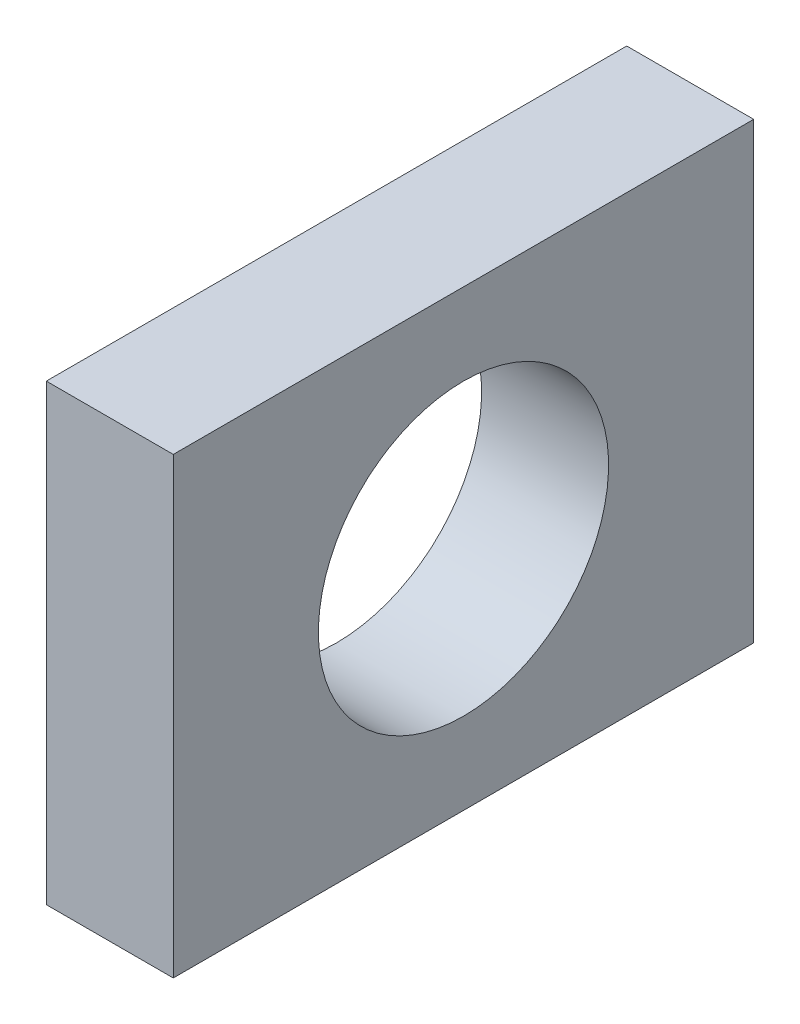
ISO-10303-21;
HEADER;
FILE_DESCRIPTION(('STEP AP214'),'2;1');
FILE_NAME('part.step','',(''),(''),'','','');
FILE_SCHEMA(('AUTOMOTIVE_DESIGN { 1 0 10303 214 1 1 1 1 }'));
ENDSEC;
DATA;
#1=APPLICATION_CONTEXT('core data for automotive mechanical design processes');
#2=APPLICATION_PROTOCOL_DEFINITION('international standard','automotive_design',2000,#1);
#3=PRODUCT_CONTEXT('',#1,'mechanical');
#4=PRODUCT('Part','Part','',(#3));
#5=PRODUCT_RELATED_PRODUCT_CATEGORY('part','',(#4));
#6=PRODUCT_DEFINITION_FORMATION('','',#4);
#7=PRODUCT_DEFINITION_CONTEXT('part definition',#1,'design');
#8=PRODUCT_DEFINITION('design','',#6,#7);
#9=PRODUCT_DEFINITION_SHAPE('','',#8);
#10=(LENGTH_UNIT() NAMED_UNIT(*) SI_UNIT(.MILLI.,.METRE.));
#11=(NAMED_UNIT(*) PLANE_ANGLE_UNIT() SI_UNIT($,.RADIAN.));
#12=(NAMED_UNIT(*) SI_UNIT($,.STERADIAN.) SOLID_ANGLE_UNIT());
#13=UNCERTAINTY_MEASURE_WITH_UNIT(LENGTH_MEASURE(1.E-05),#10,'distance_accuracy_value','');
#14=(GEOMETRIC_REPRESENTATION_CONTEXT(3) GLOBAL_UNCERTAINTY_ASSIGNED_CONTEXT((#13)) GLOBAL_UNIT_ASSIGNED_CONTEXT((#10,
#11,#12)) REPRESENTATION_CONTEXT('',''));
#15=CARTESIAN_POINT('',(0.,0.,0.));
#16=DIRECTION('',(0.,0.,1.));
#17=DIRECTION('',(1.,0.,0.));
#18=AXIS2_PLACEMENT_3D('',#15,#16,#17);
#19=CARTESIAN_POINT('',(0.,0.,8.128));
#20=DIRECTION('',(1.,0.,0.));
#21=DIRECTION('',(0.,1.,0.));
#22=AXIS2_PLACEMENT_3D('',#19,#20,#21);
#23=PLANE('',#22);
#24=CARTESIAN_POINT('',(0.,-3.175,4.064));
#25=DIRECTION('',(-1.,0.,0.));
#26=DIRECTION('',(0.,-1.,0.));
#27=AXIS2_PLACEMENT_3D('',#24,#25,#26);
#28=CIRCLE('',#27,2.032);
#29=CARTESIAN_POINT('',(0.,-5.207,4.064));
#30=VERTEX_POINT('',#29);
#31=EDGE_CURVE('E112',#30,#30,#28,.T.);
#32=ORIENTED_EDGE('',*,*,#31,.F.);
#33=EDGE_LOOP('',(#32));
#34=FACE_BOUND('',#33,.T.);
#35=DIRECTION('',(0.,-1.,0.));
#36=VECTOR('',#35,1.);
#37=CARTESIAN_POINT('',(0.,0.,0.));
#38=LINE('',#37,#36);
#39=CARTESIAN_POINT('',(0.,0.,0.));
#40=VERTEX_POINT('',#39);
#41=CARTESIAN_POINT('',(0.,-6.35,0.));
#42=VERTEX_POINT('',#41);
#43=EDGE_CURVE('E98',#40,#42,#38,.T.);
#44=ORIENTED_EDGE('',*,*,#43,.T.);
#45=DIRECTION('',(0.,0.,-1.));
#46=VECTOR('',#45,1.);
#47=CARTESIAN_POINT('',(0.,-6.35,8.128));
#48=LINE('',#47,#46);
#49=CARTESIAN_POINT('',(0.,-6.35,8.128));
#50=VERTEX_POINT('',#49);
#51=EDGE_CURVE('E11',#50,#42,#48,.T.);
#52=ORIENTED_EDGE('',*,*,#51,.F.);
#53=DIRECTION('',(0.,-1.,0.));
#54=VECTOR('',#53,1.);
#55=CARTESIAN_POINT('',(0.,0.,8.128));
#56=LINE('',#55,#54);
#57=CARTESIAN_POINT('',(0.,0.,8.128));
#58=VERTEX_POINT('',#57);
#59=EDGE_CURVE('E86',#58,#50,#56,.T.);
#60=ORIENTED_EDGE('',*,*,#59,.F.);
#61=DIRECTION('',(0.,0.,-1.));
#62=VECTOR('',#61,1.);
#63=CARTESIAN_POINT('',(0.,0.,8.128));
#64=LINE('',#63,#62);
#65=EDGE_CURVE('E94',#58,#40,#64,.T.);
#66=ORIENTED_EDGE('',*,*,#65,.T.);
#67=EDGE_LOOP('',(#44,#52,#60,#66));
#68=FACE_BOUND('',#67,.T.);
#69=ADVANCED_FACE('F35',(#34,#68),#23,.F.);
#70=CARTESIAN_POINT('',(0.,-6.35,8.128));
#71=DIRECTION('',(0.,1.,0.));
#72=DIRECTION('',(-1.,0.,0.));
#73=AXIS2_PLACEMENT_3D('',#70,#71,#72);
#74=PLANE('',#73);
#75=DIRECTION('',(1.,0.,0.));
#76=VECTOR('',#75,1.);
#77=CARTESIAN_POINT('',(0.,-6.35,0.));
#78=LINE('',#77,#76);
#79=CARTESIAN_POINT('',(1.778,-6.35,0.));
#80=VERTEX_POINT('',#79);
#81=EDGE_CURVE('E90',#42,#80,#78,.T.);
#82=ORIENTED_EDGE('',*,*,#81,.T.);
#83=DIRECTION('',(0.,0.,-1.));
#84=VECTOR('',#83,1.);
#85=CARTESIAN_POINT('',(1.778,-6.35,8.128));
#86=LINE('',#85,#84);
#87=CARTESIAN_POINT('',(1.778,-6.35,8.128));
#88=VERTEX_POINT('',#87);
#89=EDGE_CURVE('E43',#88,#80,#86,.T.);
#90=ORIENTED_EDGE('',*,*,#89,.F.);
#91=DIRECTION('',(1.,0.,0.));
#92=VECTOR('',#91,1.);
#93=CARTESIAN_POINT('',(0.,-6.35,8.128));
#94=LINE('',#93,#92);
#95=EDGE_CURVE('E81',#50,#88,#94,.T.);
#96=ORIENTED_EDGE('',*,*,#95,.F.);
#97=ORIENTED_EDGE('',*,*,#51,.T.);
#98=EDGE_LOOP('',(#82,#90,#96,#97));
#99=FACE_BOUND('',#98,.T.);
#100=ADVANCED_FACE('F89',(#99),#74,.F.);
#101=CARTESIAN_POINT('',(1.778,0.,8.128));
#102=DIRECTION('',(-1.,0.,0.));
#103=DIRECTION('',(0.,-1.,0.));
#104=AXIS2_PLACEMENT_3D('',#101,#102,#103);
#105=PLANE('',#104);
#106=CARTESIAN_POINT('',(1.778,-3.175,4.064));
#107=DIRECTION('',(-1.,0.,0.));
#108=DIRECTION('',(0.,-1.,0.));
#109=AXIS2_PLACEMENT_3D('',#106,#107,#108);
#110=CIRCLE('',#109,2.032);
#111=CARTESIAN_POINT('',(1.778,-5.207,4.064));
#112=VERTEX_POINT('',#111);
#113=EDGE_CURVE('E101',#112,#112,#110,.T.);
#114=ORIENTED_EDGE('',*,*,#113,.T.);
#115=EDGE_LOOP('',(#114));
#116=FACE_BOUND('',#115,.T.);
#117=DIRECTION('',(0.,1.,0.));
#118=VECTOR('',#117,1.);
#119=CARTESIAN_POINT('',(1.778,0.,0.));
#120=LINE('',#119,#118);
#121=CARTESIAN_POINT('',(1.778,0.,0.));
#122=VERTEX_POINT('',#121);
#123=EDGE_CURVE('E68',#80,#122,#120,.T.);
#124=ORIENTED_EDGE('',*,*,#123,.T.);
#125=DIRECTION('',(0.,0.,-1.));
#126=VECTOR('',#125,1.);
#127=CARTESIAN_POINT('',(1.778,0.,8.128));
#128=LINE('',#127,#126);
#129=CARTESIAN_POINT('',(1.778,0.,8.128));
#130=VERTEX_POINT('',#129);
#131=EDGE_CURVE('E91',#130,#122,#128,.T.);
#132=ORIENTED_EDGE('',*,*,#131,.F.);
#133=DIRECTION('',(0.,1.,0.));
#134=VECTOR('',#133,1.);
#135=CARTESIAN_POINT('',(1.778,0.,8.128));
#136=LINE('',#135,#134);
#137=EDGE_CURVE('E84',#88,#130,#136,.T.);
#138=ORIENTED_EDGE('',*,*,#137,.F.);
#139=ORIENTED_EDGE('',*,*,#89,.T.);
#140=EDGE_LOOP('',(#124,#132,#138,#139));
#141=FACE_BOUND('',#140,.T.);
#142=ADVANCED_FACE('F92',(#116,#141),#105,.F.);
#143=CARTESIAN_POINT('',(0.,0.,8.128));
#144=DIRECTION('',(0.,-1.,0.));
#145=DIRECTION('',(0.,0.,-1.));
#146=AXIS2_PLACEMENT_3D('',#143,#144,#145);
#147=PLANE('',#146);
#148=DIRECTION('',(-1.,0.,0.));
#149=VECTOR('',#148,1.);
#150=CARTESIAN_POINT('',(0.,0.,0.));
#151=LINE('',#150,#149);
#152=EDGE_CURVE('E74',#122,#40,#151,.T.);
#153=ORIENTED_EDGE('',*,*,#152,.T.);
#154=ORIENTED_EDGE('',*,*,#65,.F.);
#155=DIRECTION('',(-1.,0.,0.));
#156=VECTOR('',#155,1.);
#157=CARTESIAN_POINT('',(0.,0.,8.128));
#158=LINE('',#157,#156);
#159=EDGE_CURVE('E51',#130,#58,#158,.T.);
#160=ORIENTED_EDGE('',*,*,#159,.F.);
#161=ORIENTED_EDGE('',*,*,#131,.T.);
#162=EDGE_LOOP('',(#153,#154,#160,#161));
#163=FACE_BOUND('',#162,.T.);
#164=ADVANCED_FACE('F106',(#163),#147,.F.);
#165=CARTESIAN_POINT('',(0.,0.,8.128));
#166=DIRECTION('',(0.,0.,1.));
#167=DIRECTION('',(1.,0.,0.));
#168=AXIS2_PLACEMENT_3D('',#165,#166,#167);
#169=PLANE('',#168);
#170=ORIENTED_EDGE('',*,*,#59,.T.);
#171=ORIENTED_EDGE('',*,*,#95,.T.);
#172=ORIENTED_EDGE('',*,*,#137,.T.);
#173=ORIENTED_EDGE('',*,*,#159,.T.);
#174=EDGE_LOOP('',(#170,#171,#172,#173));
#175=FACE_BOUND('',#174,.T.);
#176=ADVANCED_FACE('F82',(#175),#169,.T.);
#177=CARTESIAN_POINT('',(0.,0.,0.));
#178=DIRECTION('',(0.,0.,1.));
#179=DIRECTION('',(1.,0.,0.));
#180=AXIS2_PLACEMENT_3D('',#177,#178,#179);
#181=PLANE('',#180);
#182=ORIENTED_EDGE('',*,*,#43,.F.);
#183=ORIENTED_EDGE('',*,*,#152,.F.);
#184=ORIENTED_EDGE('',*,*,#123,.F.);
#185=ORIENTED_EDGE('',*,*,#81,.F.);
#186=EDGE_LOOP('',(#182,#183,#184,#185));
#187=FACE_BOUND('',#186,.T.);
#188=ADVANCED_FACE('F109',(#187),#181,.F.);
#189=CARTESIAN_POINT('',(1.778,-3.175,4.064));
#190=DIRECTION('',(-1.,0.,0.));
#191=DIRECTION('',(0.,-1.,0.));
#192=AXIS2_PLACEMENT_3D('',#189,#190,#191);
#193=CYLINDRICAL_SURFACE('',#192,2.032);
#194=ORIENTED_EDGE('',*,*,#113,.F.);
#195=EDGE_LOOP('',(#194));
#196=FACE_BOUND('',#195,.T.);
#197=ORIENTED_EDGE('',*,*,#31,.T.);
#198=EDGE_LOOP('',(#197));
#199=FACE_BOUND('',#198,.T.);
#200=ADVANCED_FACE('F119',(#196,#199),#193,.F.);
#201=CLOSED_SHELL('',(#69,#100,#142,#164,#176,#188,#200));
#202=MANIFOLD_SOLID_BREP('B2',#201);
#203=ADVANCED_BREP_SHAPE_REPRESENTATION('',(#18,#202),#14);
#204=SHAPE_DEFINITION_REPRESENTATION(#9,#203);
ENDSEC;
END-ISO-10303-21;
